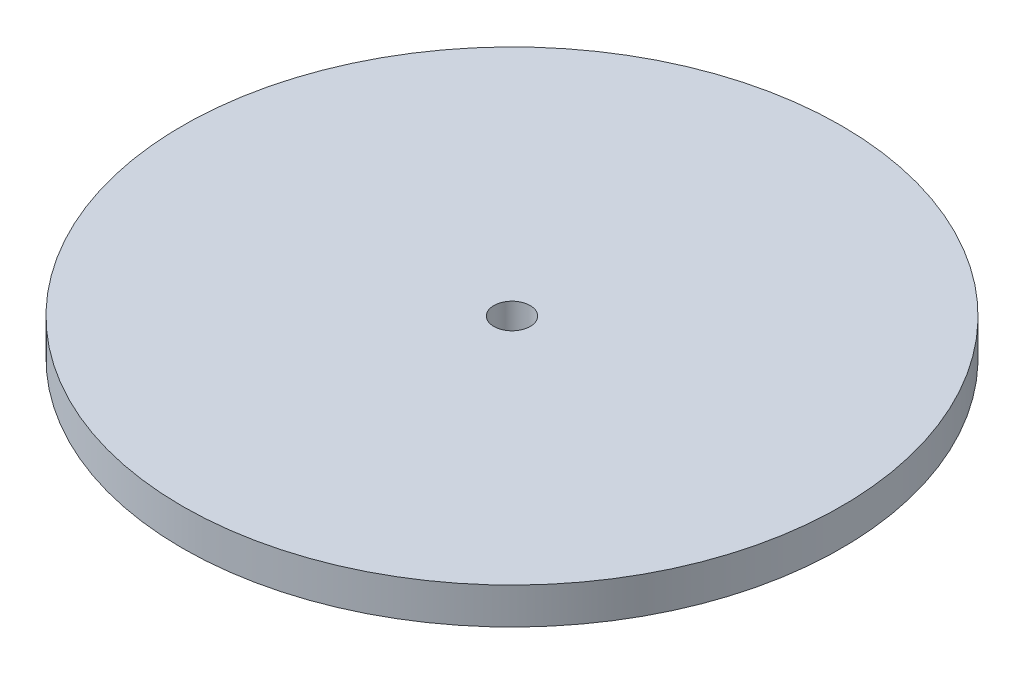
ISO-10303-21;
HEADER;
FILE_DESCRIPTION(('STEP AP214'),'2;1');
FILE_NAME('part.step','',(''),(''),'','','');
FILE_SCHEMA(('AUTOMOTIVE_DESIGN { 1 0 10303 214 1 1 1 1 }'));
ENDSEC;
DATA;
#1=APPLICATION_CONTEXT('core data for automotive mechanical design processes');
#2=APPLICATION_PROTOCOL_DEFINITION('international standard','automotive_design',2000,#1);
#3=PRODUCT_CONTEXT('',#1,'mechanical');
#4=PRODUCT('Part','Part','',(#3));
#5=PRODUCT_RELATED_PRODUCT_CATEGORY('part','',(#4));
#6=PRODUCT_DEFINITION_FORMATION('','',#4);
#7=PRODUCT_DEFINITION_CONTEXT('part definition',#1,'design');
#8=PRODUCT_DEFINITION('design','',#6,#7);
#9=PRODUCT_DEFINITION_SHAPE('','',#8);
#10=(LENGTH_UNIT() NAMED_UNIT(*) SI_UNIT(.MILLI.,.METRE.));
#11=(NAMED_UNIT(*) PLANE_ANGLE_UNIT() SI_UNIT($,.RADIAN.));
#12=(NAMED_UNIT(*) SI_UNIT($,.STERADIAN.) SOLID_ANGLE_UNIT());
#13=UNCERTAINTY_MEASURE_WITH_UNIT(LENGTH_MEASURE(1.E-05),#10,'distance_accuracy_value','');
#14=(GEOMETRIC_REPRESENTATION_CONTEXT(3) GLOBAL_UNCERTAINTY_ASSIGNED_CONTEXT((#13)) GLOBAL_UNIT_ASSIGNED_CONTEXT((#10,
#11,#12)) REPRESENTATION_CONTEXT('',''));
#15=CARTESIAN_POINT('',(0.,0.,0.));
#16=DIRECTION('',(0.,0.,1.));
#17=DIRECTION('',(1.,0.,0.));
#18=AXIS2_PLACEMENT_3D('',#15,#16,#17);
#19=CARTESIAN_POINT('',(0.,4.,0.));
#20=DIRECTION('',(0.,1.,0.));
#21=DIRECTION('',(0.,0.,1.));
#22=AXIS2_PLACEMENT_3D('',#19,#20,#21);
#23=PLANE('',#22);
#24=CARTESIAN_POINT('',(0.,4.,0.));
#25=DIRECTION('',(0.,1.,0.));
#26=DIRECTION('',(0.,0.,1.));
#27=AXIS2_PLACEMENT_3D('',#24,#25,#26);
#28=CIRCLE('',#27,36.25);
#29=CARTESIAN_POINT('',(0.,4.,36.25));
#30=VERTEX_POINT('',#29);
#31=EDGE_CURVE('E10',#30,#30,#28,.T.);
#32=ORIENTED_EDGE('',*,*,#31,.T.);
#33=EDGE_LOOP('',(#32));
#34=FACE_BOUND('',#33,.T.);
#35=CARTESIAN_POINT('',(0.,4.,0.));
#36=DIRECTION('',(0.,1.,0.));
#37=DIRECTION('',(0.,0.,1.));
#38=AXIS2_PLACEMENT_3D('',#35,#36,#37);
#39=CIRCLE('',#38,2.);
#40=CARTESIAN_POINT('',(0.,4.,2.));
#41=VERTEX_POINT('',#40);
#42=EDGE_CURVE('E43',#41,#41,#39,.T.);
#43=ORIENTED_EDGE('',*,*,#42,.F.);
#44=EDGE_LOOP('',(#43));
#45=FACE_BOUND('',#44,.T.);
#46=ADVANCED_FACE('F32',(#34,#45),#23,.T.);
#47=CARTESIAN_POINT('',(0.,0.,0.));
#48=DIRECTION('',(0.,1.,0.));
#49=DIRECTION('',(0.,0.,1.));
#50=AXIS2_PLACEMENT_3D('',#47,#48,#49);
#51=PLANE('',#50);
#52=CARTESIAN_POINT('',(0.,0.,0.));
#53=DIRECTION('',(0.,1.,0.));
#54=DIRECTION('',(0.,0.,1.));
#55=AXIS2_PLACEMENT_3D('',#52,#53,#54);
#56=CIRCLE('',#55,36.25);
#57=CARTESIAN_POINT('',(0.,0.,36.25));
#58=VERTEX_POINT('',#57);
#59=EDGE_CURVE('E36',#58,#58,#56,.T.);
#60=ORIENTED_EDGE('',*,*,#59,.F.);
#61=EDGE_LOOP('',(#60));
#62=FACE_BOUND('',#61,.T.);
#63=CARTESIAN_POINT('',(0.,0.,0.));
#64=DIRECTION('',(0.,1.,0.));
#65=DIRECTION('',(0.,0.,1.));
#66=AXIS2_PLACEMENT_3D('',#63,#64,#65);
#67=CIRCLE('',#66,2.);
#68=CARTESIAN_POINT('',(0.,0.,2.));
#69=VERTEX_POINT('',#68);
#70=EDGE_CURVE('E45',#69,#69,#67,.T.);
#71=ORIENTED_EDGE('',*,*,#70,.T.);
#72=EDGE_LOOP('',(#71));
#73=FACE_BOUND('',#72,.T.);
#74=ADVANCED_FACE('F55',(#62,#73),#51,.F.);
#75=CARTESIAN_POINT('',(0.,4.,0.));
#76=DIRECTION('',(0.,-1.,0.));
#77=DIRECTION('',(0.,0.,-1.));
#78=AXIS2_PLACEMENT_3D('',#75,#76,#77);
#79=CYLINDRICAL_SURFACE('',#78,36.25);
#80=ORIENTED_EDGE('',*,*,#31,.F.);
#81=EDGE_LOOP('',(#80));
#82=FACE_BOUND('',#81,.T.);
#83=ORIENTED_EDGE('',*,*,#59,.T.);
#84=EDGE_LOOP('',(#83));
#85=FACE_BOUND('',#84,.T.);
#86=ADVANCED_FACE('F34',(#82,#85),#79,.T.);
#87=CARTESIAN_POINT('',(0.,4.,0.));
#88=DIRECTION('',(0.,-1.,0.));
#89=DIRECTION('',(0.,0.,-1.));
#90=AXIS2_PLACEMENT_3D('',#87,#88,#89);
#91=CYLINDRICAL_SURFACE('',#90,2.);
#92=ORIENTED_EDGE('',*,*,#42,.T.);
#93=EDGE_LOOP('',(#92));
#94=FACE_BOUND('',#93,.T.);
#95=ORIENTED_EDGE('',*,*,#70,.F.);
#96=EDGE_LOOP('',(#95));
#97=FACE_BOUND('',#96,.T.);
#98=ADVANCED_FACE('F51',(#94,#97),#91,.F.);
#99=CLOSED_SHELL('',(#46,#74,#86,#98));
#100=MANIFOLD_SOLID_BREP('B2',#99);
#101=ADVANCED_BREP_SHAPE_REPRESENTATION('',(#18,#100),#14);
#102=SHAPE_DEFINITION_REPRESENTATION(#9,#101);
ENDSEC;
END-ISO-10303-21;
